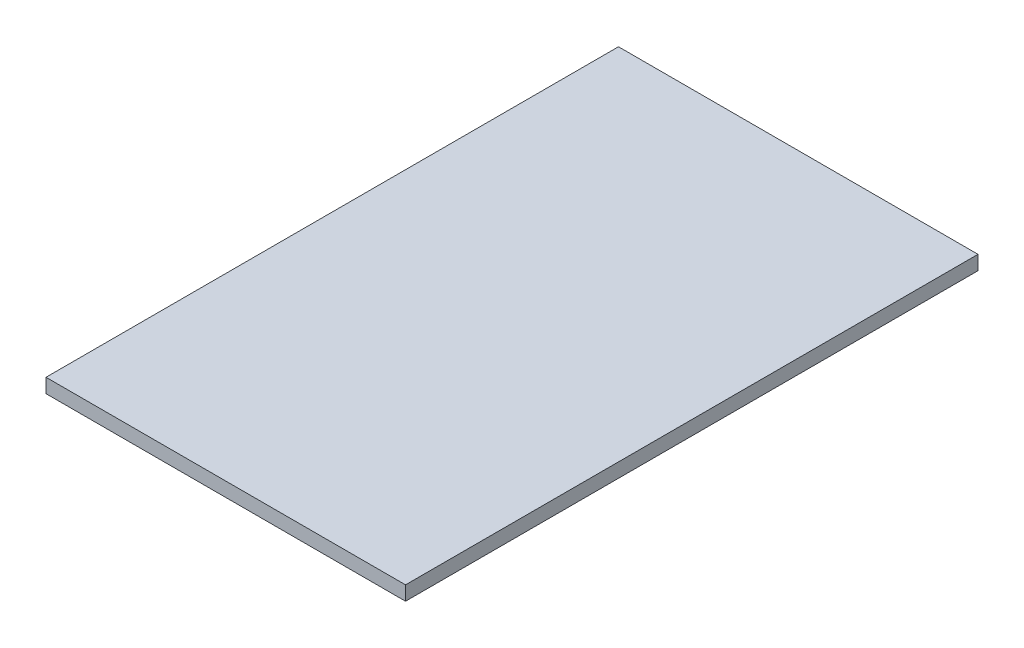
ISO-10303-21;
HEADER;
FILE_DESCRIPTION(('STEP AP214'),'2;1');
FILE_NAME('part.step','',(''),(''),'','','');
FILE_SCHEMA(('AUTOMOTIVE_DESIGN { 1 0 10303 214 1 1 1 1 }'));
ENDSEC;
DATA;
#1=APPLICATION_CONTEXT('core data for automotive mechanical design processes');
#2=APPLICATION_PROTOCOL_DEFINITION('international standard','automotive_design',2000,#1);
#3=PRODUCT_CONTEXT('',#1,'mechanical');
#4=PRODUCT('Part','Part','',(#3));
#5=PRODUCT_RELATED_PRODUCT_CATEGORY('part','',(#4));
#6=PRODUCT_DEFINITION_FORMATION('','',#4);
#7=PRODUCT_DEFINITION_CONTEXT('part definition',#1,'design');
#8=PRODUCT_DEFINITION('design','',#6,#7);
#9=PRODUCT_DEFINITION_SHAPE('','',#8);
#10=(LENGTH_UNIT() NAMED_UNIT(*) SI_UNIT(.MILLI.,.METRE.));
#11=(NAMED_UNIT(*) PLANE_ANGLE_UNIT() SI_UNIT($,.RADIAN.));
#12=(NAMED_UNIT(*) SI_UNIT($,.STERADIAN.) SOLID_ANGLE_UNIT());
#13=UNCERTAINTY_MEASURE_WITH_UNIT(LENGTH_MEASURE(1.E-05),#10,'distance_accuracy_value','');
#14=(GEOMETRIC_REPRESENTATION_CONTEXT(3) GLOBAL_UNCERTAINTY_ASSIGNED_CONTEXT((#13)) GLOBAL_UNIT_ASSIGNED_CONTEXT((#10,
#11,#12)) REPRESENTATION_CONTEXT('',''));
#15=CARTESIAN_POINT('',(0.,0.,0.));
#16=DIRECTION('',(0.,0.,1.));
#17=DIRECTION('',(1.,0.,0.));
#18=AXIS2_PLACEMENT_3D('',#15,#16,#17);
#19=CARTESIAN_POINT('',(0.,0.,0.));
#20=DIRECTION('',(0.,1.,0.));
#21=DIRECTION('',(1.,0.,0.));
#22=AXIS2_PLACEMENT_3D('',#19,#20,#21);
#23=PLANE('',#22);
#24=DIRECTION('',(-1.,0.,0.));
#25=VECTOR('',#24,1.);
#26=CARTESIAN_POINT('',(37.9,0.,-60.35));
#27=LINE('',#26,#25);
#28=CARTESIAN_POINT('',(37.9,0.,-60.35));
#29=VERTEX_POINT('',#28);
#30=CARTESIAN_POINT('',(-37.9,0.,-60.35));
#31=VERTEX_POINT('',#30);
#32=EDGE_CURVE('E25',#29,#31,#27,.T.);
#33=ORIENTED_EDGE('',*,*,#32,.F.);
#34=DIRECTION('',(0.,0.,-1.));
#35=VECTOR('',#34,1.);
#36=CARTESIAN_POINT('',(37.9,0.,60.35));
#37=LINE('',#36,#35);
#38=CARTESIAN_POINT('',(37.9,0.,60.35));
#39=VERTEX_POINT('',#38);
#40=EDGE_CURVE('E88',#39,#29,#37,.T.);
#41=ORIENTED_EDGE('',*,*,#40,.F.);
#42=DIRECTION('',(1.,0.,0.));
#43=VECTOR('',#42,1.);
#44=CARTESIAN_POINT('',(-37.9,0.,60.35));
#45=LINE('',#44,#43);
#46=CARTESIAN_POINT('',(-37.9,0.,60.35));
#47=VERTEX_POINT('',#46);
#48=EDGE_CURVE('E81',#47,#39,#45,.T.);
#49=ORIENTED_EDGE('',*,*,#48,.F.);
#50=DIRECTION('',(0.,0.,1.));
#51=VECTOR('',#50,1.);
#52=CARTESIAN_POINT('',(-37.9,0.,-60.35));
#53=LINE('',#52,#51);
#54=EDGE_CURVE('E64',#31,#47,#53,.T.);
#55=ORIENTED_EDGE('',*,*,#54,.F.);
#56=EDGE_LOOP('',(#33,#41,#49,#55));
#57=FACE_BOUND('',#56,.T.);
#58=ADVANCED_FACE('F17',(#57),#23,.F.);
#59=CARTESIAN_POINT('',(0.,3.,0.));
#60=DIRECTION('',(0.,1.,0.));
#61=DIRECTION('',(1.,0.,0.));
#62=AXIS2_PLACEMENT_3D('',#59,#60,#61);
#63=PLANE('',#62);
#64=DIRECTION('',(-1.,0.,0.));
#65=VECTOR('',#64,1.);
#66=CARTESIAN_POINT('',(37.9,3.,-60.35));
#67=LINE('',#66,#65);
#68=CARTESIAN_POINT('',(37.9,3.,-60.35));
#69=VERTEX_POINT('',#68);
#70=CARTESIAN_POINT('',(-37.9,3.,-60.35));
#71=VERTEX_POINT('',#70);
#72=EDGE_CURVE('E11',#69,#71,#67,.T.);
#73=ORIENTED_EDGE('',*,*,#72,.T.);
#74=DIRECTION('',(0.,0.,1.));
#75=VECTOR('',#74,1.);
#76=CARTESIAN_POINT('',(-37.9,3.,-60.35));
#77=LINE('',#76,#75);
#78=CARTESIAN_POINT('',(-37.9,3.,60.35));
#79=VERTEX_POINT('',#78);
#80=EDGE_CURVE('E74',#71,#79,#77,.T.);
#81=ORIENTED_EDGE('',*,*,#80,.T.);
#82=DIRECTION('',(1.,0.,0.));
#83=VECTOR('',#82,1.);
#84=CARTESIAN_POINT('',(-37.9,3.,60.35));
#85=LINE('',#84,#83);
#86=CARTESIAN_POINT('',(37.9,3.,60.35));
#87=VERTEX_POINT('',#86);
#88=EDGE_CURVE('E83',#79,#87,#85,.T.);
#89=ORIENTED_EDGE('',*,*,#88,.T.);
#90=DIRECTION('',(0.,0.,-1.));
#91=VECTOR('',#90,1.);
#92=CARTESIAN_POINT('',(37.9,3.,60.35));
#93=LINE('',#92,#91);
#94=EDGE_CURVE('E98',#87,#69,#93,.T.);
#95=ORIENTED_EDGE('',*,*,#94,.T.);
#96=EDGE_LOOP('',(#73,#81,#89,#95));
#97=FACE_BOUND('',#96,.T.);
#98=ADVANCED_FACE('F163',(#97),#63,.T.);
#99=CARTESIAN_POINT('',(37.9,0.,-60.35));
#100=DIRECTION('',(0.,0.,-1.));
#101=DIRECTION('',(0.,-1.,0.));
#102=AXIS2_PLACEMENT_3D('',#99,#100,#101);
#103=PLANE('',#102);
#104=ORIENTED_EDGE('',*,*,#32,.T.);
#105=DIRECTION('',(0.,1.,0.));
#106=VECTOR('',#105,1.);
#107=CARTESIAN_POINT('',(-37.9,0.,-60.35));
#108=LINE('',#107,#106);
#109=EDGE_CURVE('E70',#31,#71,#108,.T.);
#110=ORIENTED_EDGE('',*,*,#109,.T.);
#111=ORIENTED_EDGE('',*,*,#72,.F.);
#112=DIRECTION('',(0.,1.,0.));
#113=VECTOR('',#112,1.);
#114=CARTESIAN_POINT('',(37.9,0.,-60.35));
#115=LINE('',#114,#113);
#116=EDGE_CURVE('E139',#29,#69,#115,.T.);
#117=ORIENTED_EDGE('',*,*,#116,.F.);
#118=EDGE_LOOP('',(#104,#110,#111,#117));
#119=FACE_BOUND('',#118,.T.);
#120=ADVANCED_FACE('F167',(#119),#103,.T.);
#121=CARTESIAN_POINT('',(-37.9,0.,-60.35));
#122=DIRECTION('',(-1.,0.,0.));
#123=DIRECTION('',(0.,1.,0.));
#124=AXIS2_PLACEMENT_3D('',#121,#122,#123);
#125=PLANE('',#124);
#126=ORIENTED_EDGE('',*,*,#54,.T.);
#127=DIRECTION('',(0.,1.,0.));
#128=VECTOR('',#127,1.);
#129=CARTESIAN_POINT('',(-37.9,0.,60.35));
#130=LINE('',#129,#128);
#131=EDGE_CURVE('E68',#47,#79,#130,.T.);
#132=ORIENTED_EDGE('',*,*,#131,.T.);
#133=ORIENTED_EDGE('',*,*,#80,.F.);
#134=ORIENTED_EDGE('',*,*,#109,.F.);
#135=EDGE_LOOP('',(#126,#132,#133,#134));
#136=FACE_BOUND('',#135,.T.);
#137=ADVANCED_FACE('F66',(#136),#125,.T.);
#138=CARTESIAN_POINT('',(-37.9,0.,60.35));
#139=DIRECTION('',(0.,0.,1.));
#140=DIRECTION('',(1.,0.,0.));
#141=AXIS2_PLACEMENT_3D('',#138,#139,#140);
#142=PLANE('',#141);
#143=ORIENTED_EDGE('',*,*,#48,.T.);
#144=DIRECTION('',(0.,1.,0.));
#145=VECTOR('',#144,1.);
#146=CARTESIAN_POINT('',(37.9,0.,60.35));
#147=LINE('',#146,#145);
#148=EDGE_CURVE('E90',#39,#87,#147,.T.);
#149=ORIENTED_EDGE('',*,*,#148,.T.);
#150=ORIENTED_EDGE('',*,*,#88,.F.);
#151=ORIENTED_EDGE('',*,*,#131,.F.);
#152=EDGE_LOOP('',(#143,#149,#150,#151));
#153=FACE_BOUND('',#152,.T.);
#154=ADVANCED_FACE('F78',(#153),#142,.T.);
#155=CARTESIAN_POINT('',(37.9,0.,60.35));
#156=DIRECTION('',(1.,0.,0.));
#157=DIRECTION('',(0.,0.,-1.));
#158=AXIS2_PLACEMENT_3D('',#155,#156,#157);
#159=PLANE('',#158);
#160=ORIENTED_EDGE('',*,*,#40,.T.);
#161=ORIENTED_EDGE('',*,*,#116,.T.);
#162=ORIENTED_EDGE('',*,*,#94,.F.);
#163=ORIENTED_EDGE('',*,*,#148,.F.);
#164=EDGE_LOOP('',(#160,#161,#162,#163));
#165=FACE_BOUND('',#164,.T.);
#166=ADVANCED_FACE('F151',(#165),#159,.T.);
#167=CLOSED_SHELL('',(#58,#98,#120,#137,#154,#166));
#168=MANIFOLD_SOLID_BREP('B1',#167);
#169=ADVANCED_BREP_SHAPE_REPRESENTATION('',(#18,#168),#14);
#170=SHAPE_DEFINITION_REPRESENTATION(#9,#169);
ENDSEC;
END-ISO-10303-21;
